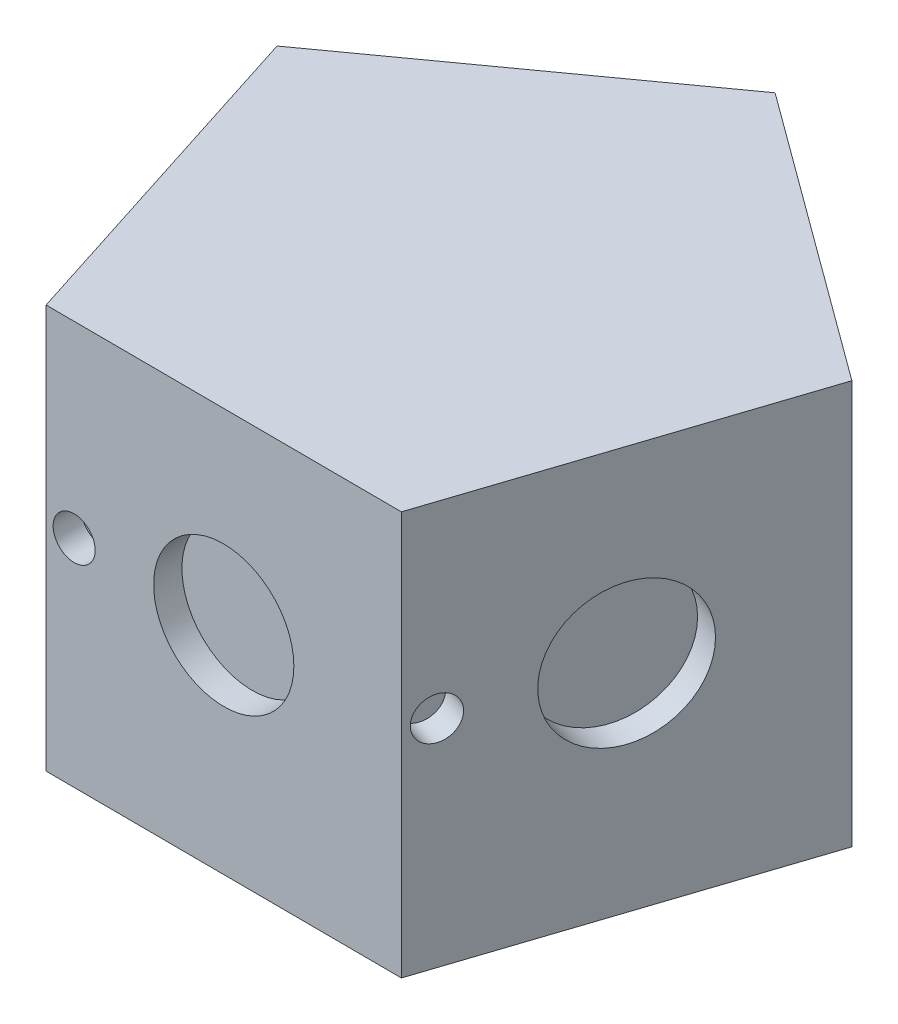
ISO-10303-21;
HEADER;
FILE_DESCRIPTION(('STEP AP214'),'2;1');
FILE_NAME('part.step','',(''),(''),'','','');
FILE_SCHEMA(('AUTOMOTIVE_DESIGN { 1 0 10303 214 1 1 1 1 }'));
ENDSEC;
DATA;
#1=APPLICATION_CONTEXT('core data for automotive mechanical design processes');
#2=APPLICATION_PROTOCOL_DEFINITION('international standard','automotive_design',2000,#1);
#3=PRODUCT_CONTEXT('',#1,'mechanical');
#4=PRODUCT('Part','Part','',(#3));
#5=PRODUCT_RELATED_PRODUCT_CATEGORY('part','',(#4));
#6=PRODUCT_DEFINITION_FORMATION('','',#4);
#7=PRODUCT_DEFINITION_CONTEXT('part definition',#1,'design');
#8=PRODUCT_DEFINITION('design','',#6,#7);
#9=PRODUCT_DEFINITION_SHAPE('','',#8);
#10=(LENGTH_UNIT() NAMED_UNIT(*) SI_UNIT(.MILLI.,.METRE.));
#11=(NAMED_UNIT(*) PLANE_ANGLE_UNIT() SI_UNIT($,.RADIAN.));
#12=(NAMED_UNIT(*) SI_UNIT($,.STERADIAN.) SOLID_ANGLE_UNIT());
#13=UNCERTAINTY_MEASURE_WITH_UNIT(LENGTH_MEASURE(1.E-05),#10,'distance_accuracy_value','');
#14=(GEOMETRIC_REPRESENTATION_CONTEXT(3) GLOBAL_UNCERTAINTY_ASSIGNED_CONTEXT((#13)) GLOBAL_UNIT_ASSIGNED_CONTEXT((#10,
#11,#12)) REPRESENTATION_CONTEXT('',''));
#15=CARTESIAN_POINT('',(0.,0.,0.));
#16=DIRECTION('',(0.,0.,1.));
#17=DIRECTION('',(1.,0.,0.));
#18=AXIS2_PLACEMENT_3D('',#15,#16,#17);
#19=CARTESIAN_POINT('',(-19.1102903614102,40.,26.0707694219707));
#20=DIRECTION('',(0.00422388322001642,0.,-0.999991079365483));
#21=DIRECTION('',(-0.999991079365483,0.,-0.00422388322001642));
#22=AXIS2_PLACEMENT_3D('',#19,#20,#21);
#23=PLANE('',#22);
#24=CARTESIAN_POINT('',(-0.110459853466028,20.,26.151023203151));
#25=DIRECTION('',(-0.00422388322001699,0.,0.999991079365483));
#26=DIRECTION('',(0.999991079365483,0.,0.00422388322001699));
#27=AXIS2_PLACEMENT_3D('',#24,#25,#26);
#28=CIRCLE('',#27,7.5);
#29=CARTESIAN_POINT('',(7.3894732417751,20.,26.1827023273011));
#30=VERTEX_POINT('',#29);
#31=EDGE_CURVE('E190',#30,#30,#28,.T.);
#32=ORIENTED_EDGE('',*,*,#31,.F.);
#33=EDGE_LOOP('',(#32));
#34=FACE_BOUND('',#33,.T.);
#35=CARTESIAN_POINT('',(-16.1103171233138,20.,26.0834410716307));
#36=DIRECTION('',(-0.00422388322001699,0.,0.999991079365483));
#37=DIRECTION('',(0.999991079365483,0.,0.00422388322001699));
#38=AXIS2_PLACEMENT_3D('',#35,#36,#37);
#39=CIRCLE('',#38,2.25);
#40=CARTESIAN_POINT('',(-13.8603371947414,20.,26.0929448088758));
#41=VERTEX_POINT('',#40);
#42=EDGE_CURVE('E173',#41,#41,#39,.T.);
#43=ORIENTED_EDGE('',*,*,#42,.F.);
#44=EDGE_LOOP('',(#43));
#45=FACE_BOUND('',#44,.T.);
#46=DIRECTION('',(0.,-1.,0.));
#47=VECTOR('',#46,1.);
#48=CARTESIAN_POINT('',(-19.1102903614102,40.,26.0707694219707));
#49=LINE('',#48,#47);
#50=CARTESIAN_POINT('',(-19.1102903614102,40.,26.0707694219707));
#51=VERTEX_POINT('',#50);
#52=CARTESIAN_POINT('',(-19.1102903614104,-3.,26.0707694219705));
#53=VERTEX_POINT('',#52);
#54=EDGE_CURVE('E212',#51,#53,#49,.T.);
#55=ORIENTED_EDGE('',*,*,#54,.T.);
#56=DIRECTION('',(-0.999991079365483,0.,-0.00422388322002364));
#57=VECTOR('',#56,1.);
#58=CARTESIAN_POINT('',(18.8893706544779,-3.,26.2312769843314));
#59=LINE('',#58,#57);
#60=CARTESIAN_POINT('',(18.8893706544779,-3.,26.2312769843314));
#61=VERTEX_POINT('',#60);
#62=EDGE_CURVE('E103',#61,#53,#59,.T.);
#63=ORIENTED_EDGE('',*,*,#62,.F.);
#64=DIRECTION('',(0.,-1.,0.));
#65=VECTOR('',#64,1.);
#66=CARTESIAN_POINT('',(18.8893706544781,40.,26.2312769843313));
#67=LINE('',#66,#65);
#68=CARTESIAN_POINT('',(18.8893706544781,40.,26.2312769843313));
#69=VERTEX_POINT('',#68);
#70=EDGE_CURVE('E11',#69,#61,#67,.T.);
#71=ORIENTED_EDGE('',*,*,#70,.F.);
#72=DIRECTION('',(0.999991079365483,0.,0.00422388322001642));
#73=VECTOR('',#72,1.);
#74=CARTESIAN_POINT('',(-19.1102903614102,40.,26.0707694219707));
#75=LINE('',#74,#73);
#76=EDGE_CURVE('E189',#51,#69,#75,.T.);
#77=ORIENTED_EDGE('',*,*,#76,.F.);
#78=EDGE_LOOP('',(#55,#63,#71,#77));
#79=FACE_BOUND('',#78,.T.);
#80=ADVANCED_FACE('F39',(#34,#45,#79),#23,.F.);
#81=CARTESIAN_POINT('',(18.8893706544781,40.,26.2312769843313));
#82=DIRECTION('',(-0.949742780570326,0.,-0.313031389407748));
#83=DIRECTION('',(-0.313031389407748,0.,0.949742780570326));
#84=AXIS2_PLACEMENT_3D('',#81,#82,#83);
#85=PLANE('',#84);
#86=CARTESIAN_POINT('',(24.8369670532254,20.,8.18616415349512));
#87=DIRECTION('',(0.949742780570326,0.,0.313031389407748));
#88=DIRECTION('',(0.313031389407748,0.,-0.949742780570326));
#89=AXIS2_PLACEMENT_3D('',#86,#87,#88);
#90=CIRCLE('',#89,7.5);
#91=CARTESIAN_POINT('',(27.1847024737835,20.,1.06309329921767));
#92=VERTEX_POINT('',#91);
#93=EDGE_CURVE('E174',#92,#92,#90,.T.);
#94=ORIENTED_EDGE('',*,*,#93,.F.);
#95=EDGE_LOOP('',(#94));
#96=FACE_BOUND('',#95,.T.);
#97=CARTESIAN_POINT('',(19.8284648227014,20.,23.3820486426203));
#98=DIRECTION('',(0.949742780570326,0.,0.313031389407748));
#99=DIRECTION('',(0.313031389407748,0.,-0.949742780570326));
#100=AXIS2_PLACEMENT_3D('',#97,#98,#99);
#101=CIRCLE('',#100,2.25);
#102=CARTESIAN_POINT('',(20.5327854488688,20.,21.2451273863371));
#103=VERTEX_POINT('',#102);
#104=EDGE_CURVE('E157',#103,#103,#101,.T.);
#105=ORIENTED_EDGE('',*,*,#104,.F.);
#106=EDGE_LOOP('',(#105));
#107=FACE_BOUND('',#106,.T.);
#108=ORIENTED_EDGE('',*,*,#70,.T.);
#109=DIRECTION('',(-0.313031389407754,0.,0.949742780570324));
#110=VECTOR('',#109,1.);
#111=CARTESIAN_POINT('',(30.7845634519726,-3.,-9.85894867734087));
#112=LINE('',#111,#110);
#113=CARTESIAN_POINT('',(30.7845634519726,-3.,-9.85894867734087));
#114=VERTEX_POINT('',#113);
#115=EDGE_CURVE('E96',#114,#61,#112,.T.);
#116=ORIENTED_EDGE('',*,*,#115,.F.);
#117=DIRECTION('',(0.,-1.,0.));
#118=VECTOR('',#117,1.);
#119=CARTESIAN_POINT('',(30.7845634519725,40.,-9.85894867734109));
#120=LINE('',#119,#118);
#121=CARTESIAN_POINT('',(30.7845634519725,40.,-9.85894867734109));
#122=VERTEX_POINT('',#121);
#123=EDGE_CURVE('E47',#122,#114,#120,.T.);
#124=ORIENTED_EDGE('',*,*,#123,.F.);
#125=DIRECTION('',(0.313031389407748,0.,-0.949742780570326));
#126=VECTOR('',#125,1.);
#127=CARTESIAN_POINT('',(18.8893706544781,40.,26.2312769843313));
#128=LINE('',#127,#126);
#129=EDGE_CURVE('E203',#69,#122,#128,.T.);
#130=ORIENTED_EDGE('',*,*,#129,.F.);
#131=EDGE_LOOP('',(#108,#116,#124,#130));
#132=FACE_BOUND('',#131,.T.);
#133=ADVANCED_FACE('F97',(#96,#107,#132),#85,.F.);
#134=CARTESIAN_POINT('',(30.7845634519725,40.,-9.85894867734109));
#135=DIRECTION('',(-0.591197202182312,0.,0.806527041165891));
#136=DIRECTION('',(0.806527041165891,0.,0.591197202182312));
#137=AXIS2_PLACEMENT_3D('',#134,#135,#136);
#138=PLANE('',#137);
#139=CARTESIAN_POINT('',(15.4605496698206,20.,-21.091695518805));
#140=DIRECTION('',(0.591197202182312,0.,-0.806527041165891));
#141=DIRECTION('',(-0.806527041165891,0.,-0.591197202182312));
#142=AXIS2_PLACEMENT_3D('',#139,#140,#141);
#143=CIRCLE('',#142,7.5);
#144=CARTESIAN_POINT('',(9.41159686107644,20.,-25.5256745351724));
#145=VERTEX_POINT('',#144);
#146=EDGE_CURVE('E158',#145,#145,#143,.T.);
#147=ORIENTED_EDGE('',*,*,#146,.F.);
#148=EDGE_LOOP('',(#147));
#149=FACE_BOUND('',#148,.T.);
#150=CARTESIAN_POINT('',(28.3649823284749,20.,-11.632540283888));
#151=DIRECTION('',(0.591197202182312,0.,-0.806527041165891));
#152=DIRECTION('',(-0.806527041165891,0.,-0.591197202182312));
#153=AXIS2_PLACEMENT_3D('',#150,#151,#152);
#154=CIRCLE('',#153,2.25);
#155=CARTESIAN_POINT('',(26.5502964858516,20.,-12.9627339887982));
#156=VERTEX_POINT('',#155);
#157=EDGE_CURVE('E141',#156,#156,#154,.T.);
#158=ORIENTED_EDGE('',*,*,#157,.F.);
#159=EDGE_LOOP('',(#158));
#160=FACE_BOUND('',#159,.T.);
#161=ORIENTED_EDGE('',*,*,#123,.T.);
#162=DIRECTION('',(0.806527041165887,0.,0.591197202182317));
#163=VECTOR('',#162,1.);
#164=CARTESIAN_POINT('',(0.1365358876689,-3.,-32.3244423602689));
#165=LINE('',#164,#163);
#166=CARTESIAN_POINT('',(0.1365358876689,-3.,-32.3244423602689));
#167=VERTEX_POINT('',#166);
#168=EDGE_CURVE('E90',#167,#114,#165,.T.);
#169=ORIENTED_EDGE('',*,*,#168,.F.);
#170=DIRECTION('',(0.,-1.,0.));
#171=VECTOR('',#170,1.);
#172=CARTESIAN_POINT('',(0.136535887668694,40.,-32.3244423602689));
#173=LINE('',#172,#171);
#174=CARTESIAN_POINT('',(0.136535887668694,40.,-32.3244423602689));
#175=VERTEX_POINT('',#174);
#176=EDGE_CURVE('E94',#175,#167,#173,.T.);
#177=ORIENTED_EDGE('',*,*,#176,.F.);
#178=DIRECTION('',(-0.806527041165891,0.,-0.591197202182312));
#179=VECTOR('',#178,1.);
#180=CARTESIAN_POINT('',(30.7845634519725,40.,-9.85894867734109));
#181=LINE('',#180,#179);
#182=EDGE_CURVE('E91',#122,#175,#181,.T.);
#183=ORIENTED_EDGE('',*,*,#182,.F.);
#184=EDGE_LOOP('',(#161,#169,#177,#183));
#185=FACE_BOUND('',#184,.T.);
#186=ADVANCED_FACE('F87',(#149,#160,#185),#138,.F.);
#187=CARTESIAN_POINT('',(0.136535887668694,40.,-32.3244423602689));
#188=DIRECTION('',(0.584362815567814,0.,0.811492513694154));
#189=DIRECTION('',(0.811492513694154,0.,-0.584362815567814));
#190=AXIS2_PLACEMENT_3D('',#187,#188,#189);
#191=PLANE('',#190);
#192=CARTESIAN_POINT('',(-15.2818218725202,20.,-21.2215488644805));
#193=DIRECTION('',(-0.584362815567814,0.,-0.811492513694154));
#194=DIRECTION('',(-0.811492513694154,0.,0.584362815567814));
#195=AXIS2_PLACEMENT_3D('',#192,#193,#194);
#196=CIRCLE('',#195,7.5);
#197=CARTESIAN_POINT('',(-21.3680157252264,20.,-16.8388277477219));
#198=VERTEX_POINT('',#197);
#199=EDGE_CURVE('E142',#198,#198,#196,.T.);
#200=ORIENTED_EDGE('',*,*,#199,.F.);
#201=EDGE_LOOP('',(#200));
#202=FACE_BOUND('',#201,.T.);
#203=CARTESIAN_POINT('',(-2.29794165341377,20.,-30.5713539135655));
#204=DIRECTION('',(-0.584362815567814,0.,-0.811492513694154));
#205=DIRECTION('',(-0.811492513694154,0.,0.584362815567814));
#206=AXIS2_PLACEMENT_3D('',#203,#204,#205);
#207=CIRCLE('',#206,2.25);
#208=CARTESIAN_POINT('',(-4.12379980922562,20.,-29.2565375785379));
#209=VERTEX_POINT('',#208);
#210=EDGE_CURVE('E125',#209,#209,#207,.T.);
#211=ORIENTED_EDGE('',*,*,#210,.F.);
#212=EDGE_LOOP('',(#211));
#213=FACE_BOUND('',#212,.T.);
#214=ORIENTED_EDGE('',*,*,#176,.T.);
#215=DIRECTION('',(0.811492513694158,0.,-0.584362815567809));
#216=VECTOR('',#215,1.);
#217=CARTESIAN_POINT('',(-30.7001796327091,-3.,-10.1186553686922));
#218=LINE('',#217,#216);
#219=CARTESIAN_POINT('',(-30.7001796327091,-3.,-10.1186553686922));
#220=VERTEX_POINT('',#219);
#221=EDGE_CURVE('E109',#220,#167,#218,.T.);
#222=ORIENTED_EDGE('',*,*,#221,.F.);
#223=DIRECTION('',(0.,-1.,0.));
#224=VECTOR('',#223,1.);
#225=CARTESIAN_POINT('',(-30.7001796327092,40.,-10.118655368692));
#226=LINE('',#225,#224);
#227=CARTESIAN_POINT('',(-30.7001796327092,40.,-10.118655368692));
#228=VERTEX_POINT('',#227);
#229=EDGE_CURVE('E215',#228,#220,#226,.T.);
#230=ORIENTED_EDGE('',*,*,#229,.F.);
#231=DIRECTION('',(-0.811492513694154,0.,0.584362815567814));
#232=VECTOR('',#231,1.);
#233=CARTESIAN_POINT('',(0.136535887668694,40.,-32.3244423602689));
#234=LINE('',#233,#232);
#235=EDGE_CURVE('E59',#175,#228,#234,.T.);
#236=ORIENTED_EDGE('',*,*,#235,.F.);
#237=EDGE_LOOP('',(#214,#222,#230,#236));
#238=FACE_BOUND('',#237,.T.);
#239=ADVANCED_FACE('F220',(#202,#213,#238),#191,.F.);
#240=CARTESIAN_POINT('',(-30.7001796327092,40.,-10.118655368692));
#241=DIRECTION('',(0.952353283964807,0.,-0.304997086086814));
#242=DIRECTION('',(-0.304997086086814,0.,-0.952353283964807));
#243=AXIS2_PLACEMENT_3D('',#240,#241,#242);
#244=PLANE('',#243);
#245=CARTESIAN_POINT('',(-24.9052349970597,20.,7.97605702663935));
#246=DIRECTION('',(-0.952353283964807,0.,0.304997086086814));
#247=DIRECTION('',(0.304997086086814,0.,0.952353283964807));
#248=AXIS2_PLACEMENT_3D('',#245,#246,#247);
#249=CIRCLE('',#248,7.5);
#250=CARTESIAN_POINT('',(-22.6177568514086,20.,15.1187066563754));
#251=VERTEX_POINT('',#250);
#252=EDGE_CURVE('E126',#251,#251,#249,.T.);
#253=ORIENTED_EDGE('',*,*,#252,.F.);
#254=EDGE_LOOP('',(#253));
#255=FACE_BOUND('',#254,.T.);
#256=CARTESIAN_POINT('',(-29.7851883744487,20.,-7.26159551679756));
#257=DIRECTION('',(-0.952353283964807,0.,0.304997086086814));
#258=DIRECTION('',(0.304997086086814,0.,0.952353283964807));
#259=AXIS2_PLACEMENT_3D('',#256,#257,#258);
#260=CIRCLE('',#259,2.25);
#261=CARTESIAN_POINT('',(-29.0989449307534,20.,-5.11880062787674));
#262=VERTEX_POINT('',#261);
#263=EDGE_CURVE('E120',#262,#262,#260,.T.);
#264=ORIENTED_EDGE('',*,*,#263,.F.);
#265=EDGE_LOOP('',(#264));
#266=FACE_BOUND('',#265,.T.);
#267=ORIENTED_EDGE('',*,*,#229,.T.);
#268=DIRECTION('',(-0.304997086086808,0.,-0.952353283964809));
#269=VECTOR('',#268,1.);
#270=CARTESIAN_POINT('',(-19.1102903614104,-3.,26.0707694219705));
#271=LINE('',#270,#269);
#272=EDGE_CURVE('E115',#53,#220,#271,.T.);
#273=ORIENTED_EDGE('',*,*,#272,.F.);
#274=ORIENTED_EDGE('',*,*,#54,.F.);
#275=DIRECTION('',(0.304997086086814,0.,0.952353283964807));
#276=VECTOR('',#275,1.);
#277=CARTESIAN_POINT('',(-30.7001796327092,40.,-10.118655368692));
#278=LINE('',#277,#276);
#279=EDGE_CURVE('E54',#228,#51,#278,.T.);
#280=ORIENTED_EDGE('',*,*,#279,.F.);
#281=EDGE_LOOP('',(#267,#273,#274,#280));
#282=FACE_BOUND('',#281,.T.);
#283=ADVANCED_FACE('F223',(#255,#266,#282),#244,.F.);
#284=CARTESIAN_POINT('',(0.,40.,0.));
#285=DIRECTION('',(0.,1.,0.));
#286=DIRECTION('',(0.,0.,1.));
#287=AXIS2_PLACEMENT_3D('',#284,#285,#286);
#288=PLANE('',#287);
#289=ORIENTED_EDGE('',*,*,#76,.T.);
#290=ORIENTED_EDGE('',*,*,#129,.T.);
#291=ORIENTED_EDGE('',*,*,#182,.T.);
#292=ORIENTED_EDGE('',*,*,#235,.T.);
#293=ORIENTED_EDGE('',*,*,#279,.T.);
#294=EDGE_LOOP('',(#289,#290,#291,#292,#293));
#295=FACE_BOUND('',#294,.T.);
#296=ADVANCED_FACE('F226',(#295),#288,.T.);
#297=CARTESIAN_POINT('',(-16.0976454736537,20.,23.0834678335343));
#298=DIRECTION('',(-0.00422388322001699,0.,0.999991079365483));
#299=DIRECTION('',(0.999991079365483,0.,0.00422388322001699));
#300=AXIS2_PLACEMENT_3D('',#297,#298,#299);
#301=CYLINDRICAL_SURFACE('',#300,2.25);
#302=CARTESIAN_POINT('',(-16.0976454736537,20.,23.0834678335343));
#303=DIRECTION('',(-0.00422388322001699,0.,0.999991079365483));
#304=DIRECTION('',(0.999991079365483,0.,0.00422388322001699));
#305=AXIS2_PLACEMENT_3D('',#302,#303,#304);
#306=CIRCLE('',#305,2.25);
#307=CARTESIAN_POINT('',(-13.8476655450814,20.,23.0929715707793));
#308=VERTEX_POINT('',#307);
#309=EDGE_CURVE('E194',#308,#308,#306,.T.);
#310=ORIENTED_EDGE('',*,*,#309,.F.);
#311=EDGE_LOOP('',(#310));
#312=FACE_BOUND('',#311,.T.);
#313=ORIENTED_EDGE('',*,*,#42,.T.);
#314=EDGE_LOOP('',(#313));
#315=FACE_BOUND('',#314,.T.);
#316=ADVANCED_FACE('F228',(#312,#315),#301,.F.);
#317=CARTESIAN_POINT('',(-16.0976454736537,20.,23.0834678335343));
#318=DIRECTION('',(-0.00422388322001699,0.,0.999991079365483));
#319=DIRECTION('',(0.999991079365483,0.,0.00422388322001699));
#320=AXIS2_PLACEMENT_3D('',#317,#318,#319);
#321=PLANE('',#320);
#322=ORIENTED_EDGE('',*,*,#309,.T.);
#323=EDGE_LOOP('',(#322));
#324=FACE_BOUND('',#323,.T.);
#325=ADVANCED_FACE('F234',(#324),#321,.T.);
#326=CARTESIAN_POINT('',(-0.0977882038059768,20.,23.1510499650546));
#327=DIRECTION('',(-0.00422388322001699,0.,0.999991079365483));
#328=DIRECTION('',(0.999991079365483,0.,0.00422388322001699));
#329=AXIS2_PLACEMENT_3D('',#326,#327,#328);
#330=CYLINDRICAL_SURFACE('',#329,7.5);
#331=CARTESIAN_POINT('',(-0.0977882038059768,20.,23.1510499650546));
#332=DIRECTION('',(-0.00422388322001699,0.,0.999991079365483));
#333=DIRECTION('',(0.999991079365483,0.,0.00422388322001699));
#334=AXIS2_PLACEMENT_3D('',#331,#332,#333);
#335=CIRCLE('',#334,7.5);
#336=CARTESIAN_POINT('',(7.40214489143515,20.,23.1827290892047));
#337=VERTEX_POINT('',#336);
#338=EDGE_CURVE('E185',#337,#337,#335,.T.);
#339=ORIENTED_EDGE('',*,*,#338,.F.);
#340=EDGE_LOOP('',(#339));
#341=FACE_BOUND('',#340,.T.);
#342=ORIENTED_EDGE('',*,*,#31,.T.);
#343=EDGE_LOOP('',(#342));
#344=FACE_BOUND('',#343,.T.);
#345=ADVANCED_FACE('F250',(#341,#344),#330,.F.);
#346=CARTESIAN_POINT('',(-0.0977882038059768,20.,23.1510499650546));
#347=DIRECTION('',(-0.00422388322001699,0.,0.999991079365483));
#348=DIRECTION('',(0.999991079365483,0.,0.00422388322001699));
#349=AXIS2_PLACEMENT_3D('',#346,#347,#348);
#350=PLANE('',#349);
#351=ORIENTED_EDGE('',*,*,#338,.T.);
#352=EDGE_LOOP('',(#351));
#353=FACE_BOUND('',#352,.T.);
#354=ADVANCED_FACE('F252',(#353),#350,.T.);
#355=CARTESIAN_POINT('',(16.9792364809904,20.,22.4429544743971));
#356=DIRECTION('',(0.949742780570326,0.,0.313031389407748));
#357=DIRECTION('',(0.313031389407748,0.,-0.949742780570326));
#358=AXIS2_PLACEMENT_3D('',#355,#356,#357);
#359=CYLINDRICAL_SURFACE('',#358,2.25);
#360=CARTESIAN_POINT('',(16.9792364809904,20.,22.4429544743971));
#361=DIRECTION('',(0.949742780570326,0.,0.313031389407748));
#362=DIRECTION('',(0.313031389407748,0.,-0.949742780570326));
#363=AXIS2_PLACEMENT_3D('',#360,#361,#362);
#364=CIRCLE('',#363,2.25);
#365=CARTESIAN_POINT('',(17.6835571071578,20.,20.3060332181139));
#366=VERTEX_POINT('',#365);
#367=EDGE_CURVE('E178',#366,#366,#364,.T.);
#368=ORIENTED_EDGE('',*,*,#367,.F.);
#369=EDGE_LOOP('',(#368));
#370=FACE_BOUND('',#369,.T.);
#371=ORIENTED_EDGE('',*,*,#104,.T.);
#372=EDGE_LOOP('',(#371));
#373=FACE_BOUND('',#372,.T.);
#374=ADVANCED_FACE('F259',(#370,#373),#359,.F.);
#375=CARTESIAN_POINT('',(16.9792364809904,20.,22.4429544743971));
#376=DIRECTION('',(0.949742780570326,0.,0.313031389407748));
#377=DIRECTION('',(0.313031389407748,0.,-0.949742780570326));
#378=AXIS2_PLACEMENT_3D('',#375,#376,#377);
#379=PLANE('',#378);
#380=ORIENTED_EDGE('',*,*,#367,.T.);
#381=EDGE_LOOP('',(#380));
#382=FACE_BOUND('',#381,.T.);
#383=ADVANCED_FACE('F268',(#382),#379,.T.);
#384=CARTESIAN_POINT('',(21.9877387115144,20.,7.24706998527188));
#385=DIRECTION('',(0.949742780570326,0.,0.313031389407748));
#386=DIRECTION('',(0.313031389407748,0.,-0.949742780570326));
#387=AXIS2_PLACEMENT_3D('',#384,#385,#386);
#388=CYLINDRICAL_SURFACE('',#387,7.5);
#389=CARTESIAN_POINT('',(21.9877387115144,20.,7.24706998527188));
#390=DIRECTION('',(0.949742780570326,0.,0.313031389407748));
#391=DIRECTION('',(0.313031389407748,0.,-0.949742780570326));
#392=AXIS2_PLACEMENT_3D('',#389,#390,#391);
#393=CIRCLE('',#392,7.5);
#394=CARTESIAN_POINT('',(24.3354741320725,20.,0.123999130994428));
#395=VERTEX_POINT('',#394);
#396=EDGE_CURVE('E169',#395,#395,#393,.T.);
#397=ORIENTED_EDGE('',*,*,#396,.F.);
#398=EDGE_LOOP('',(#397));
#399=FACE_BOUND('',#398,.T.);
#400=ORIENTED_EDGE('',*,*,#93,.T.);
#401=EDGE_LOOP('',(#400));
#402=FACE_BOUND('',#401,.T.);
#403=ADVANCED_FACE('F272',(#399,#402),#388,.F.);
#404=CARTESIAN_POINT('',(21.9877387115144,20.,7.24706998527188));
#405=DIRECTION('',(0.949742780570326,0.,0.313031389407748));
#406=DIRECTION('',(0.313031389407748,0.,-0.949742780570326));
#407=AXIS2_PLACEMENT_3D('',#404,#405,#406);
#408=PLANE('',#407);
#409=ORIENTED_EDGE('',*,*,#396,.T.);
#410=EDGE_LOOP('',(#409));
#411=FACE_BOUND('',#410,.T.);
#412=ADVANCED_FACE('F276',(#411),#408,.T.);
#413=CARTESIAN_POINT('',(26.5913907219279,20.,-9.21295916039035));
#414=DIRECTION('',(0.591197202182312,0.,-0.806527041165891));
#415=DIRECTION('',(-0.806527041165891,0.,-0.591197202182312));
#416=AXIS2_PLACEMENT_3D('',#413,#414,#415);
#417=CYLINDRICAL_SURFACE('',#416,2.25);
#418=CARTESIAN_POINT('',(26.5913907219279,20.,-9.21295916039035));
#419=DIRECTION('',(0.591197202182312,0.,-0.806527041165891));
#420=DIRECTION('',(-0.806527041165891,0.,-0.591197202182312));
#421=AXIS2_PLACEMENT_3D('',#418,#419,#420);
#422=CIRCLE('',#421,2.25);
#423=CARTESIAN_POINT('',(24.7767048793047,20.,-10.5431528653006));
#424=VERTEX_POINT('',#423);
#425=EDGE_CURVE('E162',#424,#424,#422,.T.);
#426=CARTESIAN_POINT('',(24.7767048793047,20.,-10.5431528653006));
#427=CARTESIAN_POINT('',(24.7951797918729,20.,-10.568356835337));
#428=CARTESIAN_POINT('',(24.8136547044411,20.,-10.5935608053734));
#429=CARTESIAN_POINT('',(24.8506045295775,20.,-10.6439687454463));
#430=CARTESIAN_POINT('',(24.8690794421457,20.,-10.6691727154827));
#431=CARTESIAN_POINT('',(24.9060292672821,20.,-10.7195806555556));
#432=CARTESIAN_POINT('',(24.9245041798503,20.,-10.744784625592));
#433=CARTESIAN_POINT('',(24.9614540049867,20.,-10.7951925656649));
#434=CARTESIAN_POINT('',(24.9799289175549,20.,-10.8203965357013));
#435=CARTESIAN_POINT('',(25.0168787426913,20.,-10.8708044757742));
#436=CARTESIAN_POINT('',(25.0353536552595,20.,-10.8960084458106));
#437=CARTESIAN_POINT('',(25.0723034803958,20.,-10.9464163858835));
#438=CARTESIAN_POINT('',(25.090778392964,20.,-10.9716203559199));
#439=CARTESIAN_POINT('',(25.1277282181004,20.,-11.0220282959928));
#440=CARTESIAN_POINT('',(25.1462031306686,20.,-11.0472322660292));
#441=CARTESIAN_POINT('',(25.183152955805,20.,-11.0976402061021));
#442=CARTESIAN_POINT('',(25.2016278683732,20.,-11.1228441761385));
#443=CARTESIAN_POINT('',(25.2385776935096,20.,-11.1732521162114));
#444=CARTESIAN_POINT('',(25.2570526060778,20.,-11.1984560862478));
#445=CARTESIAN_POINT('',(25.2940024312142,20.,-11.2488640263207));
#446=CARTESIAN_POINT('',(25.3124773437824,20.,-11.2740679963571));
#447=CARTESIAN_POINT('',(25.3494271689188,20.,-11.32447593643));
#448=CARTESIAN_POINT('',(25.367902081487,20.,-11.3496799064664));
#449=CARTESIAN_POINT('',(25.4048519066234,20.,-11.4000878465393));
#450=CARTESIAN_POINT('',(25.4233268191916,20.,-11.4252918165757));
#451=CARTESIAN_POINT('',(25.460276644328,20.,-11.4756997566486));
#452=CARTESIAN_POINT('',(25.4787515568962,20.,-11.500903726685));
#453=CARTESIAN_POINT('',(25.5157013820326,20.,-11.5513116667579));
#454=CARTESIAN_POINT('',(25.5341762946008,20.,-11.5765156367944));
#455=CARTESIAN_POINT('',(25.5711261197372,20.,-11.6269235768672));
#456=CARTESIAN_POINT('',(25.5896010323054,20.,-11.6521275469037));
#457=CARTESIAN_POINT('',(25.6265508574418,20.,-11.7025354869765));
#458=CARTESIAN_POINT('',(25.64502577001,20.,-11.727739457013));
#459=CARTESIAN_POINT('',(25.6819755951464,20.,-11.7781473970858));
#460=CARTESIAN_POINT('',(25.7004505077146,20.,-11.8033513671223));
#461=CARTESIAN_POINT('',(25.737400332851,20.,-11.8537593071951));
#462=CARTESIAN_POINT('',(25.7558752454191,20.,-11.8789632772316));
#463=CARTESIAN_POINT('',(25.7928250705555,20.,-11.9293712173044));
#464=CARTESIAN_POINT('',(25.8112999831237,20.,-11.9545751873409));
#465=CARTESIAN_POINT('',(25.8482498082601,20.,-12.0049831274137));
#466=CARTESIAN_POINT('',(25.8667247208283,20.,-12.0301870974502));
#467=CARTESIAN_POINT('',(25.9036745459647,20.,-12.080595037523));
#468=CARTESIAN_POINT('',(25.9221494585329,20.,-12.1057990075595));
#469=CARTESIAN_POINT('',(25.9590992836693,20.,-12.1562069476323));
#470=CARTESIAN_POINT('',(25.9775741962375,20.,-12.1814109176688));
#471=CARTESIAN_POINT('',(26.0145240213739,20.,-12.2318188577416));
#472=CARTESIAN_POINT('',(26.0329989339421,20.,-12.2570228277781));
#473=CARTESIAN_POINT('',(26.0699487590785,20.,-12.3074307678509));
#474=CARTESIAN_POINT('',(26.0884236716467,20.,-12.3326347378874));
#475=CARTESIAN_POINT('',(26.1253734967831,20.,-12.3830426779602));
#476=CARTESIAN_POINT('',(26.1438484093513,20.,-12.4082466479967));
#477=CARTESIAN_POINT('',(26.1807982344877,20.,-12.4586545880695));
#478=CARTESIAN_POINT('',(26.1992731470559,20.,-12.483858558106));
#479=CARTESIAN_POINT('',(26.2362229721923,20.,-12.5342664981788));
#480=CARTESIAN_POINT('',(26.2546978847605,20.,-12.5594704682153));
#481=CARTESIAN_POINT('',(26.2916477098969,20.,-12.6098784082882));
#482=CARTESIAN_POINT('',(26.3101226224651,20.,-12.6350823783246));
#483=CARTESIAN_POINT('',(26.3470724476015,20.,-12.6854903183975));
#484=CARTESIAN_POINT('',(26.3655473601697,20.,-12.7106942884339));
#485=CARTESIAN_POINT('',(26.4024971853061,20.,-12.7611022285068));
#486=CARTESIAN_POINT('',(26.4209720978743,20.,-12.7863061985432));
#487=CARTESIAN_POINT('',(26.4579219230106,20.,-12.8367141386161));
#488=CARTESIAN_POINT('',(26.4763968355788,20.,-12.8619181086525));
#489=CARTESIAN_POINT('',(26.5133466607152,20.,-12.9123260487254));
#490=CARTESIAN_POINT('',(26.5318215732834,20.,-12.9375300187618));
#491=CARTESIAN_POINT('',(26.5502964858516,20.,-12.9627339887982));
#492=B_SPLINE_CURVE_WITH_KNOTS('',3,(#426,#427,#428,#429,#430,#431,#432,#433,#434,#435,#436,
#437,#438,#439,#440,#441,#442,#443,#444,#445,#446,#447,#448,#449,#450,#451,#452,#453,#454,#455,
#456,#457,#458,#459,#460,#461,#462,#463,#464,#465,#466,#467,#468,#469,#470,#471,#472,#473,#474,
#475,#476,#477,#478,#479,#480,#481,#482,#483,#484,#485,#486,#487,#488,#489,#490,#491),
.UNSPECIFIED.,.F.,.F.,(4,2,2,2,2,2,2,2,2,2,2,2,2,2,2,2,2,2,2,2,2,2,2,2,2,2,2,2,2,2,2,2,4),(0.,
0.0937499999999988,0.1875,0.281249999999998,0.374999999999999,0.468749999999999,
0.562499999999998,0.656249999999999,0.749999999999998,0.843749999999999,0.937499999999999,
1.03125,1.125,1.21875,1.3125,1.40625,1.5,1.59375,1.6875,1.78125,1.875,1.96875,2.0625,2.15625,
2.25,2.34375,2.4375,2.53125,2.625,2.71875,2.8125,2.90625,3.),.UNSPECIFIED.);
#493=EDGE_CURVE('BSEAM280',#424,#156,#492,.T.);
#494=ORIENTED_EDGE('',*,*,#425,.F.);
#495=ORIENTED_EDGE('',*,*,#157,.T.);
#496=ORIENTED_EDGE('',*,*,#493,.T.);
#497=ORIENTED_EDGE('',*,*,#493,.F.);
#498=EDGE_LOOP('',(#494,#496,#495,#497));
#499=FACE_BOUND('',#498,.T.);
#500=ADVANCED_FACE('F280',(#499),#417,.F.);
#501=CARTESIAN_POINT('',(26.5913907219279,20.,-9.21295916039035));
#502=DIRECTION('',(0.591197202182312,0.,-0.806527041165891));
#503=DIRECTION('',(-0.806527041165891,0.,-0.591197202182312));
#504=AXIS2_PLACEMENT_3D('',#501,#502,#503);
#505=PLANE('',#504);
#506=ORIENTED_EDGE('',*,*,#425,.T.);
#507=EDGE_LOOP('',(#506));
#508=FACE_BOUND('',#507,.T.);
#509=ADVANCED_FACE('F284',(#508),#505,.T.);
#510=CARTESIAN_POINT('',(13.6869580632737,20.,-18.6721143953073));
#511=DIRECTION('',(0.591197202182312,0.,-0.806527041165891));
#512=DIRECTION('',(-0.806527041165891,0.,-0.591197202182312));
#513=AXIS2_PLACEMENT_3D('',#510,#511,#512);
#514=CYLINDRICAL_SURFACE('',#513,7.5);
#515=CARTESIAN_POINT('',(13.6869580632737,20.,-18.6721143953073));
#516=DIRECTION('',(0.591197202182312,0.,-0.806527041165891));
#517=DIRECTION('',(-0.806527041165891,0.,-0.591197202182312));
#518=AXIS2_PLACEMENT_3D('',#515,#516,#517);
#519=CIRCLE('',#518,7.5);
#520=CARTESIAN_POINT('',(7.63800525452951,20.,-23.1060934116747));
#521=VERTEX_POINT('',#520);
#522=EDGE_CURVE('E153',#521,#521,#519,.T.);
#523=CARTESIAN_POINT('',(7.63800525452951,20.,-23.1060934116747));
#524=CARTESIAN_POINT('',(7.6564801670977,20.,-23.1312973817111));
#525=CARTESIAN_POINT('',(7.6749550796659,20.,-23.1565013517476));
#526=CARTESIAN_POINT('',(7.71190490480229,20.,-23.2069092918204));
#527=CARTESIAN_POINT('',(7.73037981737049,20.,-23.2321132618569));
#528=CARTESIAN_POINT('',(7.76732964250689,20.,-23.2825212019297));
#529=CARTESIAN_POINT('',(7.78580455507508,20.,-23.3077251719662));
#530=CARTESIAN_POINT('',(7.82275438021148,20.,-23.358133112039));
#531=CARTESIAN_POINT('',(7.84122929277968,20.,-23.3833370820755));
#532=CARTESIAN_POINT('',(7.87817911791607,20.,-23.4337450221483));
#533=CARTESIAN_POINT('',(7.89665403048427,20.,-23.4589489921848));
#534=CARTESIAN_POINT('',(7.93360385562066,20.,-23.5093569322576));
#535=CARTESIAN_POINT('',(7.95207876818886,20.,-23.5345609022941));
#536=CARTESIAN_POINT('',(7.98902859332525,20.,-23.5849688423669));
#537=CARTESIAN_POINT('',(8.00750350589345,20.,-23.6101728124034));
#538=CARTESIAN_POINT('',(8.04445333102985,20.,-23.6605807524762));
#539=CARTESIAN_POINT('',(8.06292824359804,20.,-23.6857847225127));
#540=CARTESIAN_POINT('',(8.09987806873444,20.,-23.7361926625855));
#541=CARTESIAN_POINT('',(8.11835298130264,20.,-23.761396632622));
#542=CARTESIAN_POINT('',(8.15530280643903,20.,-23.8118045726948));
#543=CARTESIAN_POINT('',(8.17377771900723,20.,-23.8370085427313));
#544=CARTESIAN_POINT('',(8.21072754414362,20.,-23.8874164828041));
#545=CARTESIAN_POINT('',(8.22920245671182,20.,-23.9126204528406));
#546=CARTESIAN_POINT('',(8.26615228184821,20.,-23.9630283929134));
#547=CARTESIAN_POINT('',(8.28462719441641,20.,-23.9882323629499));
#548=CARTESIAN_POINT('',(8.3215770195528,20.,-24.0386403030227));
#549=CARTESIAN_POINT('',(8.340051932121,20.,-24.0638442730592));
#550=CARTESIAN_POINT('',(8.3770017572574,20.,-24.1142522131321));
#551=CARTESIAN_POINT('',(8.39547666982559,20.,-24.1394561831685));
#552=CARTESIAN_POINT('',(8.43242649496199,20.,-24.1898641232414));
#553=CARTESIAN_POINT('',(8.45090140753019,20.,-24.2150680932778));
#554=CARTESIAN_POINT('',(8.48785123266658,20.,-24.2654760333507));
#555=CARTESIAN_POINT('',(8.50632614523478,20.,-24.2906800033871));
#556=CARTESIAN_POINT('',(8.54327597037117,20.,-24.34108794346));
#557=CARTESIAN_POINT('',(8.56175088293937,20.,-24.3662919134964));
#558=CARTESIAN_POINT('',(8.59870070807576,20.,-24.4166998535693));
#559=CARTESIAN_POINT('',(8.61717562064396,20.,-24.4419038236057));
#560=CARTESIAN_POINT('',(8.65412544578035,20.,-24.4923117636786));
#561=CARTESIAN_POINT('',(8.67260035834855,20.,-24.517515733715));
#562=CARTESIAN_POINT('',(8.70955018348495,20.,-24.5679236737879));
#563=CARTESIAN_POINT('',(8.72802509605314,20.,-24.5931276438243));
#564=CARTESIAN_POINT('',(8.76497492118954,20.,-24.6435355838972));
#565=CARTESIAN_POINT('',(8.78344983375774,20.,-24.6687395539336));
#566=CARTESIAN_POINT('',(8.82039965889413,20.,-24.7191474940065));
#567=CARTESIAN_POINT('',(8.83887457146233,20.,-24.7443514640429));
#568=CARTESIAN_POINT('',(8.87582439659872,20.,-24.7947594041158));
#569=CARTESIAN_POINT('',(8.89429930916692,20.,-24.8199633741522));
#570=CARTESIAN_POINT('',(8.93124913430331,20.,-24.8703713142251));
#571=CARTESIAN_POINT('',(8.94972404687151,20.,-24.8955752842615));
#572=CARTESIAN_POINT('',(8.98667387200791,20.,-24.9459832243344));
#573=CARTESIAN_POINT('',(9.0051487845761,20.,-24.9711871943708));
#574=CARTESIAN_POINT('',(9.0420986097125,20.,-25.0215951344437));
#575=CARTESIAN_POINT('',(9.06057352228069,20.,-25.0467991044801));
#576=CARTESIAN_POINT('',(9.09752334741709,20.,-25.097207044553));
#577=CARTESIAN_POINT('',(9.11599825998529,20.,-25.1224110145894));
#578=CARTESIAN_POINT('',(9.15294808512168,20.,-25.1728189546623));
#579=CARTESIAN_POINT('',(9.17142299768988,20.,-25.1980229246987));
#580=CARTESIAN_POINT('',(9.20837282282627,20.,-25.2484308647716));
#581=CARTESIAN_POINT('',(9.22684773539447,20.,-25.273634834808));
#582=CARTESIAN_POINT('',(9.26379756053086,20.,-25.3240427748809));
#583=CARTESIAN_POINT('',(9.28227247309906,20.,-25.3492467449173));
#584=CARTESIAN_POINT('',(9.31922229823546,20.,-25.3996546849902));
#585=CARTESIAN_POINT('',(9.33769721080365,20.,-25.4248586550266));
#586=CARTESIAN_POINT('',(9.37464703594005,20.,-25.4752665950995));
#587=CARTESIAN_POINT('',(9.39312194850825,20.,-25.5004705651359));
#588=CARTESIAN_POINT('',(9.41159686107644,20.,-25.5256745351724));
#589=B_SPLINE_CURVE_WITH_KNOTS('',3,(#523,#524,#525,#526,#527,#528,#529,#530,#531,#532,#533,
#534,#535,#536,#537,#538,#539,#540,#541,#542,#543,#544,#545,#546,#547,#548,#549,#550,#551,#552,
#553,#554,#555,#556,#557,#558,#559,#560,#561,#562,#563,#564,#565,#566,#567,#568,#569,#570,#571,
#572,#573,#574,#575,#576,#577,#578,#579,#580,#581,#582,#583,#584,#585,#586,#587,#588),
.UNSPECIFIED.,.F.,.F.,(4,2,2,2,2,2,2,2,2,2,2,2,2,2,2,2,2,2,2,2,2,2,2,2,2,2,2,2,2,2,2,2,4),(0.,
0.0937500000000012,0.1875,0.281250000000001,0.375000000000001,0.46875,0.562500000000001,0.65625,
0.750000000000001,0.843750000000002,0.937500000000001,1.03125,1.125,1.21875,1.3125,1.40625,1.5,
1.59375,1.6875,1.78125,1.875,1.96875,2.0625,2.15625,2.25,2.34375,2.4375,2.53125,2.625,2.71875,
2.8125,2.90625,3.),.UNSPECIFIED.);
#590=EDGE_CURVE('BSEAM288',#521,#145,#589,.T.);
#591=ORIENTED_EDGE('',*,*,#522,.F.);
#592=ORIENTED_EDGE('',*,*,#146,.T.);
#593=ORIENTED_EDGE('',*,*,#590,.T.);
#594=ORIENTED_EDGE('',*,*,#590,.F.);
#595=EDGE_LOOP('',(#591,#593,#592,#594));
#596=FACE_BOUND('',#595,.T.);
#597=ADVANCED_FACE('F288',(#596),#514,.F.);
#598=CARTESIAN_POINT('',(13.6869580632737,20.,-18.6721143953073));
#599=DIRECTION('',(0.591197202182312,0.,-0.806527041165891));
#600=DIRECTION('',(-0.806527041165891,0.,-0.591197202182312));
#601=AXIS2_PLACEMENT_3D('',#598,#599,#600);
#602=PLANE('',#601);
#603=ORIENTED_EDGE('',*,*,#522,.T.);
#604=EDGE_LOOP('',(#603));
#605=FACE_BOUND('',#604,.T.);
#606=ADVANCED_FACE('F292',(#605),#602,.T.);
#607=CARTESIAN_POINT('',(-0.544853206710331,20.,-28.136876372483));
#608=DIRECTION('',(-0.584362815567814,0.,-0.811492513694154));
#609=DIRECTION('',(-0.811492513694154,0.,0.584362815567814));
#610=AXIS2_PLACEMENT_3D('',#607,#608,#609);
#611=CYLINDRICAL_SURFACE('',#610,2.25);
#612=CARTESIAN_POINT('',(-0.544853206710331,20.,-28.136876372483));
#613=DIRECTION('',(-0.584362815567814,0.,-0.811492513694154));
#614=DIRECTION('',(-0.811492513694154,0.,0.584362815567814));
#615=AXIS2_PLACEMENT_3D('',#612,#613,#614);
#616=CIRCLE('',#615,2.25);
#617=CARTESIAN_POINT('',(-2.37071136252218,20.,-26.8220600374554));
#618=VERTEX_POINT('',#617);
#619=EDGE_CURVE('E146',#618,#618,#616,.T.);
#620=CARTESIAN_POINT('',(-2.37071136252218,20.,-26.8220600374554));
#621=CARTESIAN_POINT('',(-2.38897270050867,20.,-26.8474191785084));
#622=CARTESIAN_POINT('',(-2.40723403849517,20.,-26.8727783195613));
#623=CARTESIAN_POINT('',(-2.44375671446815,20.,-26.9234966016672));
#624=CARTESIAN_POINT('',(-2.46201805245465,20.,-26.9488557427202));
#625=CARTESIAN_POINT('',(-2.49854072842764,20.,-26.999574024826));
#626=CARTESIAN_POINT('',(-2.51680206641413,20.,-27.024933165879));
#627=CARTESIAN_POINT('',(-2.55332474238712,20.,-27.0756514479849));
#628=CARTESIAN_POINT('',(-2.57158608037361,20.,-27.1010105890378));
#629=CARTESIAN_POINT('',(-2.6081087563466,20.,-27.1517288711437));
#630=CARTESIAN_POINT('',(-2.6263700943331,20.,-27.1770880121966));
#631=CARTESIAN_POINT('',(-2.66289277030608,20.,-27.2278062943025));
#632=CARTESIAN_POINT('',(-2.68115410829258,20.,-27.2531654353555));
#633=CARTESIAN_POINT('',(-2.71767678426557,20.,-27.3038837174614));
#634=CARTESIAN_POINT('',(-2.73593812225206,20.,-27.3292428585143));
#635=CARTESIAN_POINT('',(-2.77246079822505,20.,-27.3799611406202));
#636=CARTESIAN_POINT('',(-2.79072213621154,20.,-27.4053202816731));
#637=CARTESIAN_POINT('',(-2.82724481218453,20.,-27.456038563779));
#638=CARTESIAN_POINT('',(-2.84550615017103,20.,-27.4813977048319));
#639=CARTESIAN_POINT('',(-2.88202882614402,20.,-27.5321159869378));
#640=CARTESIAN_POINT('',(-2.90029016413051,20.,-27.5574751279908));
#641=CARTESIAN_POINT('',(-2.9368128401035,20.,-27.6081934100967));
#642=CARTESIAN_POINT('',(-2.95507417808999,20.,-27.6335525511496));
#643=CARTESIAN_POINT('',(-2.99159685406298,20.,-27.6842708332555));
#644=CARTESIAN_POINT('',(-3.00985819204947,20.,-27.7096299743084));
#645=CARTESIAN_POINT('',(-3.04638086802246,20.,-27.7603482564143));
#646=CARTESIAN_POINT('',(-3.06464220600896,20.,-27.7857073974673));
#647=CARTESIAN_POINT('',(-3.10116488198195,20.,-27.8364256795731));
#648=CARTESIAN_POINT('',(-3.11942621996844,20.,-27.8617848206261));
#649=CARTESIAN_POINT('',(-3.15594889594143,20.,-27.912503102732));
#650=CARTESIAN_POINT('',(-3.17421023392792,20.,-27.9378622437849));
#651=CARTESIAN_POINT('',(-3.21073290990091,20.,-27.9885805258908));
#652=CARTESIAN_POINT('',(-3.2289942478874,20.,-28.0139396669437));
#653=CARTESIAN_POINT('',(-3.26551692386039,20.,-28.0646579490496));
#654=CARTESIAN_POINT('',(-3.28377826184689,20.,-28.0900170901026));
#655=CARTESIAN_POINT('',(-3.32030093781988,20.,-28.1407353722084));
#656=CARTESIAN_POINT('',(-3.33856227580637,20.,-28.1660945132614));
#657=CARTESIAN_POINT('',(-3.37508495177936,20.,-28.2168127953673));
#658=CARTESIAN_POINT('',(-3.39334628976585,20.,-28.2421719364202));
#659=CARTESIAN_POINT('',(-3.42986896573884,20.,-28.2928902185261));
#660=CARTESIAN_POINT('',(-3.44813030372533,20.,-28.318249359579));
#661=CARTESIAN_POINT('',(-3.48465297969832,20.,-28.3689676416849));
#662=CARTESIAN_POINT('',(-3.50291431768482,20.,-28.3943267827379));
#663=CARTESIAN_POINT('',(-3.53943699365781,20.,-28.4450450648438));
#664=CARTESIAN_POINT('',(-3.5576983316443,20.,-28.4704042058967));
#665=CARTESIAN_POINT('',(-3.59422100761729,20.,-28.5211224880026));
#666=CARTESIAN_POINT('',(-3.61248234560378,20.,-28.5464816290555));
#667=CARTESIAN_POINT('',(-3.64900502157677,20.,-28.5971999111614));
#668=CARTESIAN_POINT('',(-3.66726635956326,20.,-28.6225590522143));
#669=CARTESIAN_POINT('',(-3.70378903553625,20.,-28.6732773343202));
#670=CARTESIAN_POINT('',(-3.72205037352275,20.,-28.6986364753732));
#671=CARTESIAN_POINT('',(-3.75857304949574,20.,-28.7493547574791));
#672=CARTESIAN_POINT('',(-3.77683438748223,20.,-28.774713898532));
#673=CARTESIAN_POINT('',(-3.81335706345522,20.,-28.8254321806379));
#674=CARTESIAN_POINT('',(-3.83161840144171,20.,-28.8507913216908));
#675=CARTESIAN_POINT('',(-3.8681410774147,20.,-28.9015096037967));
#676=CARTESIAN_POINT('',(-3.88640241540119,20.,-28.9268687448497));
#677=CARTESIAN_POINT('',(-3.92292509137418,20.,-28.9775870269555));
#678=CARTESIAN_POINT('',(-3.94118642936068,20.,-29.0029461680085));
#679=CARTESIAN_POINT('',(-3.97770910533367,20.,-29.0536644501144));
#680=CARTESIAN_POINT('',(-3.99597044332016,20.,-29.0790235911673));
#681=CARTESIAN_POINT('',(-4.03249311929315,20.,-29.1297418732732));
#682=CARTESIAN_POINT('',(-4.05075445727964,20.,-29.1551010143261));
#683=CARTESIAN_POINT('',(-4.08727713325263,20.,-29.205819296432));
#684=CARTESIAN_POINT('',(-4.10553847123912,20.,-29.231178437485));
#685=CARTESIAN_POINT('',(-4.12379980922562,20.,-29.2565375785379));
#686=B_SPLINE_CURVE_WITH_KNOTS('',3,(#620,#621,#622,#623,#624,#625,#626,#627,#628,#629,#630,
#631,#632,#633,#634,#635,#636,#637,#638,#639,#640,#641,#642,#643,#644,#645,#646,#647,#648,#649,
#650,#651,#652,#653,#654,#655,#656,#657,#658,#659,#660,#661,#662,#663,#664,#665,#666,#667,#668,
#669,#670,#671,#672,#673,#674,#675,#676,#677,#678,#679,#680,#681,#682,#683,#684,#685),
.UNSPECIFIED.,.F.,.F.,(4,2,2,2,2,2,2,2,2,2,2,2,2,2,2,2,2,2,2,2,2,2,2,2,2,2,2,2,2,2,2,2,4),(0.,
0.0937500000000009,0.187500000000002,0.28125,0.375000000000001,0.468750000000002,0.5625,
0.656250000000001,0.749999999999999,0.843750000000001,0.937500000000001,1.03125,1.125,1.21875,
1.3125,1.40625,1.5,1.59375,1.6875,1.78125,1.875,1.96875,2.0625,2.15625,2.25,2.34375,2.4375,
2.53125,2.625,2.71875,2.8125,2.90625,3.),.UNSPECIFIED.);
#687=EDGE_CURVE('BSEAM296',#618,#209,#686,.T.);
#688=ORIENTED_EDGE('',*,*,#619,.F.);
#689=ORIENTED_EDGE('',*,*,#210,.T.);
#690=ORIENTED_EDGE('',*,*,#687,.T.);
#691=ORIENTED_EDGE('',*,*,#687,.F.);
#692=EDGE_LOOP('',(#688,#690,#689,#691));
#693=FACE_BOUND('',#692,.T.);
#694=ADVANCED_FACE('F296',(#693),#611,.F.);
#695=CARTESIAN_POINT('',(-0.544853206710331,20.,-28.136876372483));
#696=DIRECTION('',(-0.584362815567814,0.,-0.811492513694154));
#697=DIRECTION('',(-0.811492513694154,0.,0.584362815567814));
#698=AXIS2_PLACEMENT_3D('',#695,#696,#697);
#699=PLANE('',#698);
#700=ORIENTED_EDGE('',*,*,#619,.T.);
#701=EDGE_LOOP('',(#700));
#702=FACE_BOUND('',#701,.T.);
#703=ADVANCED_FACE('F300',(#702),#699,.T.);
#704=CARTESIAN_POINT('',(-13.5287334258168,20.,-18.787071323398));
#705=DIRECTION('',(-0.584362815567814,0.,-0.811492513694154));
#706=DIRECTION('',(-0.811492513694154,0.,0.584362815567814));
#707=AXIS2_PLACEMENT_3D('',#704,#705,#706);
#708=CYLINDRICAL_SURFACE('',#707,7.5);
#709=CARTESIAN_POINT('',(-13.5287334258168,20.,-18.787071323398));
#710=DIRECTION('',(-0.584362815567814,0.,-0.811492513694154));
#711=DIRECTION('',(-0.811492513694154,0.,0.584362815567814));
#712=AXIS2_PLACEMENT_3D('',#709,#710,#711);
#713=CIRCLE('',#712,7.5);
#714=CARTESIAN_POINT('',(-19.614927278523,20.,-14.4043502066394));
#715=VERTEX_POINT('',#714);
#716=EDGE_CURVE('E137',#715,#715,#713,.T.);
#717=CARTESIAN_POINT('',(-19.614927278523,20.,-14.4043502066394));
#718=CARTESIAN_POINT('',(-19.6331886165095,20.,-14.4297093476923));
#719=CARTESIAN_POINT('',(-19.6514499544959,20.,-14.4550684887453));
#720=CARTESIAN_POINT('',(-19.6879726304689,20.,-14.5057867708512));
#721=CARTESIAN_POINT('',(-19.7062339684554,20.,-14.5311459119041));
#722=CARTESIAN_POINT('',(-19.7427566444284,20.,-14.58186419401));
#723=CARTESIAN_POINT('',(-19.7610179824149,20.,-14.6072233350629));
#724=CARTESIAN_POINT('',(-19.7975406583879,20.,-14.6579416171688));
#725=CARTESIAN_POINT('',(-19.8158019963744,20.,-14.6833007582218));
#726=CARTESIAN_POINT('',(-19.8523246723474,20.,-14.7340190403277));
#727=CARTESIAN_POINT('',(-19.8705860103339,20.,-14.7593781813806));
#728=CARTESIAN_POINT('',(-19.9071086863069,20.,-14.8100964634865));
#729=CARTESIAN_POINT('',(-19.9253700242934,20.,-14.8354556045394));
#730=CARTESIAN_POINT('',(-19.9618927002663,20.,-14.8861738866453));
#731=CARTESIAN_POINT('',(-19.9801540382528,20.,-14.9115330276982));
#732=CARTESIAN_POINT('',(-20.0166767142258,20.,-14.9622513098041));
#733=CARTESIAN_POINT('',(-20.0349380522123,20.,-14.9876104508571));
#734=CARTESIAN_POINT('',(-20.0714607281853,20.,-15.038328732963));
#735=CARTESIAN_POINT('',(-20.0897220661718,20.,-15.0636878740159));
#736=CARTESIAN_POINT('',(-20.1262447421448,20.,-15.1144061561218));
#737=CARTESIAN_POINT('',(-20.1445060801313,20.,-15.1397652971747));
#738=CARTESIAN_POINT('',(-20.1810287561043,20.,-15.1904835792806));
#739=CARTESIAN_POINT('',(-20.1992900940908,20.,-15.2158427203336));
#740=CARTESIAN_POINT('',(-20.2358127700638,20.,-15.2665610024394));
#741=CARTESIAN_POINT('',(-20.2540741080503,20.,-15.2919201434924));
#742=CARTESIAN_POINT('',(-20.2905967840232,20.,-15.3426384255983));
#743=CARTESIAN_POINT('',(-20.3088581220097,20.,-15.3679975666512));
#744=CARTESIAN_POINT('',(-20.3453807979827,20.,-15.4187158487571));
#745=CARTESIAN_POINT('',(-20.3636421359692,20.,-15.44407498981));
#746=CARTESIAN_POINT('',(-20.4001648119422,20.,-15.4947932719159));
#747=CARTESIAN_POINT('',(-20.4184261499287,20.,-15.5201524129689));
#748=CARTESIAN_POINT('',(-20.4549488259017,20.,-15.5708706950747));
#749=CARTESIAN_POINT('',(-20.4732101638882,20.,-15.5962298361277));
#750=CARTESIAN_POINT('',(-20.5097328398612,20.,-15.6469481182336));
#751=CARTESIAN_POINT('',(-20.5279941778477,20.,-15.6723072592865));
#752=CARTESIAN_POINT('',(-20.5645168538207,20.,-15.7230255413924));
#753=CARTESIAN_POINT('',(-20.5827781918072,20.,-15.7483846824453));
#754=CARTESIAN_POINT('',(-20.6193008677801,20.,-15.7991029645512));
#755=CARTESIAN_POINT('',(-20.6375622057666,20.,-15.8244621056042));
#756=CARTESIAN_POINT('',(-20.6740848817396,20.,-15.8751803877101));
#757=CARTESIAN_POINT('',(-20.6923462197261,20.,-15.900539528763));
#758=CARTESIAN_POINT('',(-20.7288688956991,20.,-15.9512578108689));
#759=CARTESIAN_POINT('',(-20.7471302336856,20.,-15.9766169519218));
#760=CARTESIAN_POINT('',(-20.7836529096586,20.,-16.0273352340277));
#761=CARTESIAN_POINT('',(-20.8019142476451,20.,-16.0526943750806));
#762=CARTESIAN_POINT('',(-20.8384369236181,20.,-16.1034126571865));
#763=CARTESIAN_POINT('',(-20.8566982616046,20.,-16.1287717982395));
#764=CARTESIAN_POINT('',(-20.8932209375775,20.,-16.1794900803454));
#765=CARTESIAN_POINT('',(-20.911482275564,20.,-16.2048492213983));
#766=CARTESIAN_POINT('',(-20.948004951537,20.,-16.2555675035042));
#767=CARTESIAN_POINT('',(-20.9662662895235,20.,-16.2809266445571));
#768=CARTESIAN_POINT('',(-21.0027889654965,20.,-16.331644926663));
#769=CARTESIAN_POINT('',(-21.021050303483,20.,-16.357004067716));
#770=CARTESIAN_POINT('',(-21.057572979456,20.,-16.4077223498218));
#771=CARTESIAN_POINT('',(-21.0758343174425,20.,-16.4330814908748));
#772=CARTESIAN_POINT('',(-21.1123569934155,20.,-16.4837997729807));
#773=CARTESIAN_POINT('',(-21.130618331402,20.,-16.5091589140336));
#774=CARTESIAN_POINT('',(-21.167141007375,20.,-16.5598771961395));
#775=CARTESIAN_POINT('',(-21.1854023453615,20.,-16.5852363371924));
#776=CARTESIAN_POINT('',(-21.2219250213344,20.,-16.6359546192983));
#777=CARTESIAN_POINT('',(-21.2401863593209,20.,-16.6613137603513));
#778=CARTESIAN_POINT('',(-21.2767090352939,20.,-16.7120320424571));
#779=CARTESIAN_POINT('',(-21.2949703732804,20.,-16.7373911835101));
#780=CARTESIAN_POINT('',(-21.3314930492534,20.,-16.788109465616));
#781=CARTESIAN_POINT('',(-21.3497543872399,20.,-16.8134686066689));
#782=CARTESIAN_POINT('',(-21.3680157252264,20.,-16.8388277477219));
#783=B_SPLINE_CURVE_WITH_KNOTS('',3,(#717,#718,#719,#720,#721,#722,#723,#724,#725,#726,#727,
#728,#729,#730,#731,#732,#733,#734,#735,#736,#737,#738,#739,#740,#741,#742,#743,#744,#745,#746,
#747,#748,#749,#750,#751,#752,#753,#754,#755,#756,#757,#758,#759,#760,#761,#762,#763,#764,#765,
#766,#767,#768,#769,#770,#771,#772,#773,#774,#775,#776,#777,#778,#779,#780,#781,#782),
.UNSPECIFIED.,.F.,.F.,(4,2,2,2,2,2,2,2,2,2,2,2,2,2,2,2,2,2,2,2,2,2,2,2,2,2,2,2,2,2,2,2,4),(0.,
0.093749999999999,0.187499999999998,0.281249999999999,0.375,0.468749999999999,0.562499999999998,
0.656249999999999,0.749999999999999,0.843749999999998,0.937499999999999,1.03125,1.125,1.21875,
1.3125,1.40625,1.5,1.59375,1.6875,1.78125,1.875,1.96875,2.0625,2.15625,2.25,2.34375,2.4375,
2.53125,2.625,2.71875,2.8125,2.90625,3.),.UNSPECIFIED.);
#784=EDGE_CURVE('BSEAM304',#715,#198,#783,.T.);
#785=ORIENTED_EDGE('',*,*,#716,.F.);
#786=ORIENTED_EDGE('',*,*,#199,.T.);
#787=ORIENTED_EDGE('',*,*,#784,.T.);
#788=ORIENTED_EDGE('',*,*,#784,.F.);
#789=EDGE_LOOP('',(#785,#787,#786,#788));
#790=FACE_BOUND('',#789,.T.);
#791=ADVANCED_FACE('F304',(#790),#708,.F.);
#792=CARTESIAN_POINT('',(-13.5287334258168,20.,-18.787071323398));
#793=DIRECTION('',(-0.584362815567814,0.,-0.811492513694154));
#794=DIRECTION('',(-0.811492513694154,0.,0.584362815567814));
#795=AXIS2_PLACEMENT_3D('',#792,#793,#794);
#796=PLANE('',#795);
#797=ORIENTED_EDGE('',*,*,#716,.T.);
#798=EDGE_LOOP('',(#797));
#799=FACE_BOUND('',#798,.T.);
#800=ADVANCED_FACE('F308',(#799),#796,.T.);
#801=CARTESIAN_POINT('',(-26.9281285225543,20.,-8.176586775058));
#802=DIRECTION('',(-0.952353283964807,0.,0.304997086086814));
#803=DIRECTION('',(0.304997086086814,0.,0.952353283964807));
#804=AXIS2_PLACEMENT_3D('',#801,#802,#803);
#805=CYLINDRICAL_SURFACE('',#804,2.25);
#806=CARTESIAN_POINT('',(-26.9281285225543,20.,-8.176586775058));
#807=DIRECTION('',(-0.952353283964807,0.,0.304997086086814));
#808=DIRECTION('',(0.304997086086814,0.,0.952353283964807));
#809=AXIS2_PLACEMENT_3D('',#806,#807,#808);
#810=CIRCLE('',#809,2.25);
#811=CARTESIAN_POINT('',(-26.241885078859,20.,-6.03379188613718));
#812=VERTEX_POINT('',#811);
#813=EDGE_CURVE('E130',#812,#812,#810,.T.);
#814=ORIENTED_EDGE('',*,*,#813,.F.);
#815=EDGE_LOOP('',(#814));
#816=FACE_BOUND('',#815,.T.);
#817=ORIENTED_EDGE('',*,*,#263,.T.);
#818=EDGE_LOOP('',(#817));
#819=FACE_BOUND('',#818,.T.);
#820=ADVANCED_FACE('F312',(#816,#819),#805,.F.);
#821=CARTESIAN_POINT('',(-26.9281285225543,20.,-8.176586775058));
#822=DIRECTION('',(-0.952353283964807,0.,0.304997086086814));
#823=DIRECTION('',(0.304997086086814,0.,0.952353283964807));
#824=AXIS2_PLACEMENT_3D('',#821,#822,#823);
#825=PLANE('',#824);
#826=ORIENTED_EDGE('',*,*,#813,.T.);
#827=EDGE_LOOP('',(#826));
#828=FACE_BOUND('',#827,.T.);
#829=ADVANCED_FACE('F316',(#828),#825,.T.);
#830=CARTESIAN_POINT('',(-22.0481751451653,20.,7.06106576837891));
#831=DIRECTION('',(-0.952353283964807,0.,0.304997086086814));
#832=DIRECTION('',(0.304997086086814,0.,0.952353283964807));
#833=AXIS2_PLACEMENT_3D('',#830,#831,#832);
#834=CYLINDRICAL_SURFACE('',#833,7.5);
#835=CARTESIAN_POINT('',(-22.0481751451653,20.,7.06106576837891));
#836=DIRECTION('',(-0.952353283964807,0.,0.304997086086814));
#837=DIRECTION('',(0.304997086086814,0.,0.952353283964807));
#838=AXIS2_PLACEMENT_3D('',#835,#836,#837);
#839=CIRCLE('',#838,7.5);
#840=CARTESIAN_POINT('',(-19.7606969995142,20.,14.203715398115));
#841=VERTEX_POINT('',#840);
#842=EDGE_CURVE('E121',#841,#841,#839,.T.);
#843=ORIENTED_EDGE('',*,*,#842,.F.);
#844=EDGE_LOOP('',(#843));
#845=FACE_BOUND('',#844,.T.);
#846=ORIENTED_EDGE('',*,*,#252,.T.);
#847=EDGE_LOOP('',(#846));
#848=FACE_BOUND('',#847,.T.);
#849=ADVANCED_FACE('F320',(#845,#848),#834,.F.);
#850=CARTESIAN_POINT('',(-22.0481751451653,20.,7.06106576837891));
#851=DIRECTION('',(-0.952353283964807,0.,0.304997086086814));
#852=DIRECTION('',(0.304997086086814,0.,0.952353283964807));
#853=AXIS2_PLACEMENT_3D('',#850,#851,#852);
#854=PLANE('',#853);
#855=ORIENTED_EDGE('',*,*,#842,.T.);
#856=EDGE_LOOP('',(#855));
#857=FACE_BOUND('',#856,.T.);
#858=ADVANCED_FACE('F324',(#857),#854,.T.);
#859=CARTESIAN_POINT('',(0.,-3.,0.));
#860=DIRECTION('',(0.,-1.,0.));
#861=DIRECTION('',(0.,0.,-1.));
#862=AXIS2_PLACEMENT_3D('',#859,#860,#861);
#863=PLANE('',#862);
#864=ORIENTED_EDGE('',*,*,#168,.T.);
#865=ORIENTED_EDGE('',*,*,#115,.T.);
#866=ORIENTED_EDGE('',*,*,#62,.T.);
#867=ORIENTED_EDGE('',*,*,#272,.T.);
#868=ORIENTED_EDGE('',*,*,#221,.T.);
#869=EDGE_LOOP('',(#864,#865,#866,#867,#868));
#870=FACE_BOUND('',#869,.T.);
#871=ADVANCED_FACE('F106',(#870),#863,.T.);
#872=CLOSED_SHELL('',(#80,#133,#186,#239,#283,#296,#316,#325,#345,#354,#374,#383,#403,#412,#500,
#509,#597,#606,#694,#703,#791,#800,#820,#829,#849,#858,#871));
#873=MANIFOLD_SOLID_BREP('B2',#872);
#874=ADVANCED_BREP_SHAPE_REPRESENTATION('',(#18,#873),#14);
#875=SHAPE_DEFINITION_REPRESENTATION(#9,#874);
ENDSEC;
END-ISO-10303-21;
